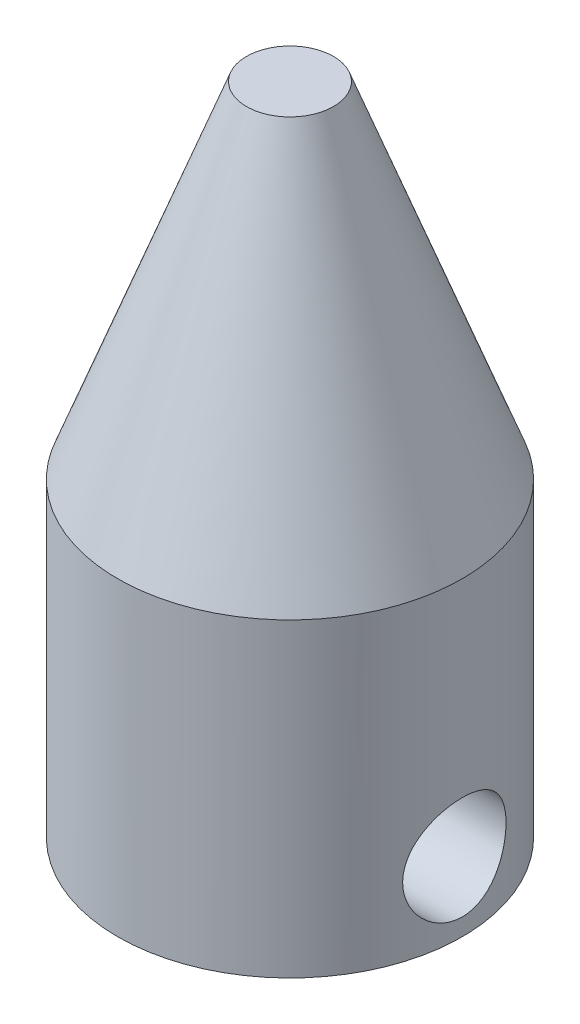
ISO-10303-21;
HEADER;
FILE_DESCRIPTION(('STEP AP214'),'2;1');
FILE_NAME('part.step','',(''),(''),'','','');
FILE_SCHEMA(('AUTOMOTIVE_DESIGN { 1 0 10303 214 1 1 1 1 }'));
ENDSEC;
DATA;
#1=APPLICATION_CONTEXT('core data for automotive mechanical design processes');
#2=APPLICATION_PROTOCOL_DEFINITION('international standard','automotive_design',2000,#1);
#3=PRODUCT_CONTEXT('',#1,'mechanical');
#4=PRODUCT('Part','Part','',(#3));
#5=PRODUCT_RELATED_PRODUCT_CATEGORY('part','',(#4));
#6=PRODUCT_DEFINITION_FORMATION('','',#4);
#7=PRODUCT_DEFINITION_CONTEXT('part definition',#1,'design');
#8=PRODUCT_DEFINITION('design','',#6,#7);
#9=PRODUCT_DEFINITION_SHAPE('','',#8);
#10=(LENGTH_UNIT() NAMED_UNIT(*) SI_UNIT(.MILLI.,.METRE.));
#11=(NAMED_UNIT(*) PLANE_ANGLE_UNIT() SI_UNIT($,.RADIAN.));
#12=(NAMED_UNIT(*) SI_UNIT($,.STERADIAN.) SOLID_ANGLE_UNIT());
#13=UNCERTAINTY_MEASURE_WITH_UNIT(LENGTH_MEASURE(1.E-05),#10,'distance_accuracy_value','');
#14=(GEOMETRIC_REPRESENTATION_CONTEXT(3) GLOBAL_UNCERTAINTY_ASSIGNED_CONTEXT((#13)) GLOBAL_UNIT_ASSIGNED_CONTEXT((#10,
#11,#12)) REPRESENTATION_CONTEXT('',''));
#15=CARTESIAN_POINT('',(0.,0.,0.));
#16=DIRECTION('',(0.,0.,1.));
#17=DIRECTION('',(1.,0.,0.));
#18=AXIS2_PLACEMENT_3D('',#15,#16,#17);
#19=CARTESIAN_POINT('',(0.,9.,0.));
#20=DIRECTION('',(0.,-1.,0.));
#21=DIRECTION('',(0.,0.,-1.));
#22=AXIS2_PLACEMENT_3D('',#19,#20,#21);
#23=CYLINDRICAL_SURFACE('',#22,5.);
#24=CARTESIAN_POINT('',(-5.,0.5,0.));
#25=CARTESIAN_POINT('',(-4.9999992925055,0.500000997484886,-0.0822886127533));
#26=CARTESIAN_POINT('',(-4.99794915693954,0.506793863623966,-0.164587318351529));
#27=CARTESIAN_POINT('',(-4.98997105593691,0.533721354222101,-0.326788125304881));
#28=CARTESIAN_POINT('',(-4.98404193389692,0.553859958023342,-0.40668950441142));
#29=CARTESIAN_POINT('',(-4.96895552501836,0.606746016910264,-0.561732707754527));
#30=CARTESIAN_POINT('',(-4.95980300250425,0.639474869618937,-0.636881364395373));
#31=CARTESIAN_POINT('',(-4.93922109237645,0.716536093055836,-0.780624181053131));
#32=CARTESIAN_POINT('',(-4.92779140192067,0.760870007395417,-0.84921746746967));
#33=CARTESIAN_POINT('',(-4.90350737192774,0.861224007472669,-0.979871797183745));
#34=CARTESIAN_POINT('',(-4.89062383657036,0.917516625885914,-1.04171807124434));
#35=CARTESIAN_POINT('',(-4.86505834210442,1.03960922991018,-1.15524920923324));
#36=CARTESIAN_POINT('',(-4.85237641724501,1.10541081212496,-1.20693236327441));
#37=CARTESIAN_POINT('',(-4.82834113993772,1.24647075303761,-1.29980037723708));
#38=CARTESIAN_POINT('',(-4.81702406663875,1.32190846099074,-1.34072309022213));
#39=CARTESIAN_POINT('',(-4.79743620394031,1.47898925423029,-1.4092139477476));
#40=CARTESIAN_POINT('',(-4.78916468313311,1.56063084392798,-1.43678529919973));
#41=CARTESIAN_POINT('',(-4.77690870838434,1.72539026613046,-1.47701633682652));
#42=CARTESIAN_POINT('',(-4.77281069324533,1.80840274386394,-1.49007196234677));
#43=CARTESIAN_POINT('',(-4.76902789749767,1.97553315621677,-1.50213730614672));
#44=CARTESIAN_POINT('',(-4.76934204760571,2.05965081805909,-1.50115042761078));
#45=CARTESIAN_POINT('',(-4.77424744067778,2.22338390860848,-1.48546977199812));
#46=CARTESIAN_POINT('',(-4.7786838859914,2.30305225036224,-1.47127205262685));
#47=CARTESIAN_POINT('',(-4.79108356228624,2.45881978627346,-1.43037420427056));
#48=CARTESIAN_POINT('',(-4.79904714132351,2.53491862737433,-1.40367284141641));
#49=CARTESIAN_POINT('',(-4.81772733074973,2.68260034966074,-1.33816026653682));
#50=CARTESIAN_POINT('',(-4.82848016115952,2.75410708395526,-1.29918816934642));
#51=CARTESIAN_POINT('',(-4.85150987000065,2.88973202201019,-1.21035222588683));
#52=CARTESIAN_POINT('',(-4.86378711746991,2.95384842941378,-1.16048574002588));
#53=CARTESIAN_POINT('',(-4.88911011297937,3.07568619076202,-1.04881290765546));
#54=CARTESIAN_POINT('',(-4.90216654310498,3.13302866402967,-0.986594907466972));
#55=CARTESIAN_POINT('',(-4.92712244063259,3.23655398406425,-0.853263259313967));
#56=CARTESIAN_POINT('',(-4.9390218351841,3.28273612841443,-0.782149051860888));
#57=CARTESIAN_POINT('',(-4.9604316006947,3.36285992246473,-0.632355038342803));
#58=CARTESIAN_POINT('',(-4.96992543668314,3.39671751624986,-0.55362774974795));
#59=CARTESIAN_POINT('',(-4.98533521832222,3.45059959009963,-0.39124541560352));
#60=CARTESIAN_POINT('',(-4.99125216186999,3.47062792853249,-0.307591751589582));
#61=CARTESIAN_POINT('',(-4.99868364643538,3.49565217789939,-0.140952242668332));
#62=CARTESIAN_POINT('',(-5.0003485041779,3.50116158580161,-0.0580500976011871));
#63=CARTESIAN_POINT('',(-4.9995292324176,3.49843084428792,0.107499605823383));
#64=CARTESIAN_POINT('',(-4.99704565677756,3.49019253034856,0.19014719669078));
#65=CARTESIAN_POINT('',(-4.98830696987163,3.4606153888885,0.350903605309697));
#66=CARTESIAN_POINT('',(-4.98213829799417,3.43957661241913,0.429072772614169));
#67=CARTESIAN_POINT('',(-4.96674347841533,3.3853567672218,0.580754638954522));
#68=CARTESIAN_POINT('',(-4.95751696321085,3.35217423896214,0.654266777025583));
#69=CARTESIAN_POINT('',(-4.93669654351325,3.27374683451887,0.796437189461052));
#70=CARTESIAN_POINT('',(-4.92505280829675,3.22824065905203,0.864943826199669));
#71=CARTESIAN_POINT('',(-4.90073468764318,3.12677524594719,0.993523307980147));
#72=CARTESIAN_POINT('',(-4.8880600443108,3.07081338811233,1.05359403235593));
#73=CARTESIAN_POINT('',(-4.86253171869138,2.94761269163066,1.16585744551027));
#74=CARTESIAN_POINT('',(-4.84968825033268,2.88003812422826,1.21768481231503));
#75=CARTESIAN_POINT('',(-4.82576515238464,2.73687206098647,1.30928995072154));
#76=CARTESIAN_POINT('',(-4.81468547654651,2.66128077544179,1.34906803829472));
#77=CARTESIAN_POINT('',(-4.79567189615055,2.50446750874531,1.41517347127168));
#78=CARTESIAN_POINT('',(-4.78772337843827,2.42327381346341,1.4415634693705));
#79=CARTESIAN_POINT('',(-4.77591594362794,2.25731203106852,1.48021730815114));
#80=CARTESIAN_POINT('',(-4.772055625083,2.17254517921233,1.49248598978779));
#81=CARTESIAN_POINT('',(-4.76899972496087,2.00563848162377,1.50221984485059));
#82=CARTESIAN_POINT('',(-4.76961647442754,1.92353634898242,1.5002805530849));
#83=CARTESIAN_POINT('',(-4.77499401288294,1.7608858966272,1.48307505444813));
#84=CARTESIAN_POINT('',(-4.77975463592551,1.68033751482365,1.46780938124716));
#85=CARTESIAN_POINT('',(-4.79275763670385,1.52405460085715,1.42476888804136));
#86=CARTESIAN_POINT('',(-4.80095604545965,1.44827271263831,1.39715175507068));
#87=CARTESIAN_POINT('',(-4.81990278909136,1.30235756118228,1.33031507121129));
#88=CARTESIAN_POINT('',(-4.83065161194312,1.23222538235924,1.29109329962876));
#89=CARTESIAN_POINT('',(-4.85397676425833,1.09683688347289,1.20048763805072));
#90=CARTESIAN_POINT('',(-4.86660540163798,1.03185123873959,1.14871276092994));
#91=CARTESIAN_POINT('',(-4.89201320450026,0.911297501692137,1.03517434629782));
#92=CARTESIAN_POINT('',(-4.90479240823905,0.855731860532243,0.973408217134502));
#93=CARTESIAN_POINT('',(-4.92950936570649,0.75397658770497,0.839465762183249));
#94=CARTESIAN_POINT('',(-4.94141159765674,0.708108553144511,0.767037885790608));
#95=CARTESIAN_POINT('',(-4.96260680455813,0.629264830095975,0.615141373983529));
#96=CARTESIAN_POINT('',(-4.97190099931067,0.596283111725492,0.535676052998955));
#97=CARTESIAN_POINT('',(-4.98602174969301,0.547104724347251,0.380757712655282));
#98=CARTESIAN_POINT('',(-4.99122027381068,0.529488327116752,0.305786961954234));
#99=CARTESIAN_POINT('',(-4.99820944494492,0.505936474758423,0.15388019523078));
#100=CARTESIAN_POINT('',(-5.0000006615474,0.499999067295181,0.0769445098581397));
#101=CARTESIAN_POINT('',(-5.,0.5,0.));
#102=B_SPLINE_CURVE_WITH_KNOTS('',3,(#24,#25,#26,#27,#28,#29,#30,#31,#32,#33,#34,#35,#36,#37,
#38,#39,#40,#41,#42,#43,#44,#45,#46,#47,#48,#49,#50,#51,#52,#53,#54,#55,#56,#57,#58,#59,#60,#61,
#62,#63,#64,#65,#66,#67,#68,#69,#70,#71,#72,#73,#74,#75,#76,#77,#78,#79,#80,#81,#82,#83,#84,#85,
#86,#87,#88,#89,#90,#91,#92,#93,#94,#95,#96,#97,#98,#99,#100,#101),.UNSPECIFIED.,.T.,.F.,(4,2,2,
2,2,2,2,2,2,2,2,2,2,2,2,2,2,2,2,2,2,2,2,2,2,2,2,2,2,2,2,2,2,2,2,2,2,2,4),(0.,0.246583203612611,
0.493239964846,0.739533676300874,0.985860164412702,1.23855602948191,1.49129437288633,
1.74971481004109,2.00807314543224,2.25919689356599,2.51025978319089,2.75226016697676,
2.99428443658001,3.23962426447119,3.48502360158555,3.74067104048166,3.99633456531071,
4.25371046881688,4.51101453528808,4.75908809438545,5.00712853550327,5.24956746682327,
5.49203554593728,5.74011305702908,5.98825282000191,6.24540400322818,6.5025484425268,
6.75847814951252,7.01432009460283,7.25950155466943,7.504673196616,7.74680040402721,
7.98897397553107,8.23996925679931,8.49102974897502,8.74942996156671,9.00770911595235,
9.23831691930459,9.46888616948874),.UNSPECIFIED.);
#103=CARTESIAN_POINT('',(-5.,0.5,0.));
#104=VERTEX_POINT('',#103);
#105=EDGE_CURVE('E11',#104,#104,#102,.T.);
#106=ORIENTED_EDGE('',*,*,#105,.T.);
#107=EDGE_LOOP('',(#106));
#108=FACE_BOUND('',#107,.T.);
#109=CARTESIAN_POINT('',(4.76969600708473,2.,-1.5));
#110=CARTESIAN_POINT('',(4.7696968572698,1.9178054520576,-1.49999897633764));
#111=CARTESIAN_POINT('',(4.77184390209069,1.83560077585598,-1.49322108167142));
#112=CARTESIAN_POINT('',(4.780165783029,1.67359475040806,-1.46635844446749));
#113=CARTESIAN_POINT('',(4.78634196493468,1.59379421349853,-1.44626925573578));
#114=CARTESIAN_POINT('',(4.80196102485632,1.43896527172827,-1.39352753269955));
#115=CARTESIAN_POINT('',(4.81139846703232,1.36392917036691,-1.36089589394243));
#116=CARTESIAN_POINT('',(4.83246932547567,1.2203780660047,-1.28406421917929));
#117=CARTESIAN_POINT('',(4.84410307041019,1.15186404131556,-1.23986245137053));
#118=CARTESIAN_POINT('',(4.86866862185765,1.02113360942262,-1.13964754141627));
#119=CARTESIAN_POINT('',(4.88162808311636,0.959154102053713,-1.08333207175807));
#120=CARTESIAN_POINT('',(4.90714861936757,0.845362048677491,-0.961136237579599));
#121=CARTESIAN_POINT('',(4.91970964297705,0.793550809550121,-0.895254645461111));
#122=CARTESIAN_POINT('',(4.94333214579389,0.700537300166693,-0.75411143779369));
#123=CARTESIAN_POINT('',(4.95435724342404,0.659576575557191,-0.678684021335815));
#124=CARTESIAN_POINT('',(4.97334435920684,0.591012740957243,-0.521624645369354));
#125=CARTESIAN_POINT('',(4.98130703789495,0.563406750142551,-0.439994028387912));
#126=CARTESIAN_POINT('',(4.99307646003589,0.523119998909491,-0.27532385263083));
#127=CARTESIAN_POINT('',(4.99699557369338,0.510034872347297,-0.192391398953801));
#128=CARTESIAN_POINT('',(5.00063201501348,0.497882675353559,-0.025421823749315));
#129=CARTESIAN_POINT('',(5.00035022521079,0.498812660598037,0.0586150620503682));
#130=CARTESIAN_POINT('',(4.99569603817659,0.514392868543023,0.22257115660016));
#131=CARTESIAN_POINT('',(4.9914542020526,0.528605193809869,0.302536267641341));
#132=CARTESIAN_POINT('',(4.97951522112593,0.56963133599429,0.458889213442527));
#133=CARTESIAN_POINT('',(4.97181785750586,0.596445950942671,0.535276821322846));
#134=CARTESIAN_POINT('',(4.95365220986963,0.662212023418558,0.683347326351281));
#135=CARTESIAN_POINT('',(4.94315269676706,0.701301202807267,0.754965064694478));
#136=CARTESIAN_POINT('',(4.92049640648069,0.790397852428228,0.890764673783156));
#137=CARTESIAN_POINT('',(4.90833923637778,0.840407912963484,0.954944774872131));
#138=CARTESIAN_POINT('',(4.88311550488165,0.952197750751597,1.0766604815298));
#139=CARTESIAN_POINT('',(4.87003195321461,1.01435691902974,1.13384458040111));
#140=CARTESIAN_POINT('',(4.84483979887497,1.14751001789005,1.23707651539824));
#141=CARTESIAN_POINT('',(4.8327312931702,1.21850482538923,1.28312324482853));
#142=CARTESIAN_POINT('',(4.81077903197678,1.36823946924899,1.3631399533545));
#143=CARTESIAN_POINT('',(4.80095810695957,1.44704704586292,1.39698989237679));
#144=CARTESIAN_POINT('',(4.78496392548436,1.60960720844554,1.45083362878413));
#145=CARTESIAN_POINT('',(4.7787894791583,1.69335817153456,1.4708319464056));
#146=CARTESIAN_POINT('',(4.77104849541241,1.86008236073928,1.49574770282165));
#147=CARTESIAN_POINT('',(4.7693187867044,1.94296822389398,1.50119946380212));
#148=CARTESIAN_POINT('',(4.77021192441924,2.10847290000987,1.49835947233062));
#149=CARTESIAN_POINT('',(4.77283416156589,2.19109174873085,1.4900696437133));
#150=CARTESIAN_POINT('',(4.78197558554912,2.35148837797087,1.4604576357419));
#151=CARTESIAN_POINT('',(4.78839176507489,2.42933616426352,1.4394796143128));
#152=CARTESIAN_POINT('',(4.80429141231227,2.58040169081492,1.3854857774794));
#153=CARTESIAN_POINT('',(4.81377535359073,2.65361871414057,1.3524681034276));
#154=CARTESIAN_POINT('',(4.83505835023047,2.79551746407213,1.274318711965));
#155=CARTESIAN_POINT('',(4.84691271069799,2.86402472098579,1.22888564172729));
#156=CARTESIAN_POINT('',(4.87148205646987,2.9926381061808,1.12755301600385));
#157=CARTESIAN_POINT('',(4.88419724730003,3.05274221761279,1.07165095534897));
#158=CARTESIAN_POINT('',(4.90963633548158,3.16518040581474,0.948455132493599));
#159=CARTESIAN_POINT('',(4.92234245063004,3.21713562898698,0.880811065857434));
#160=CARTESIAN_POINT('',(4.94584851748651,3.30896670102775,0.737461784590249));
#161=CARTESIAN_POINT('',(4.95664856384717,3.34884314978146,0.661756970543944));
#162=CARTESIAN_POINT('',(4.97505970474957,3.4150000305683,0.504935504705222));
#163=CARTESIAN_POINT('',(4.98269453424966,3.44138201615898,0.423864622037839));
#164=CARTESIAN_POINT('',(4.99401979596827,3.48006091889042,0.258169966504588));
#165=CARTESIAN_POINT('',(4.9977113567088,3.49236186594842,0.173547217354763));
#166=CARTESIAN_POINT('',(5.00066544081399,3.5022230440545,0.00665215388274265));
#167=CARTESIAN_POINT('',(5.00009305111322,3.50033269540783,-0.0755851790862068));
#168=CARTESIAN_POINT('',(4.99497264465037,3.48317836750088,-0.238519481164404));
#169=CARTESIAN_POINT('',(4.99042485330462,3.46791514651956,-0.319216537346529));
#170=CARTESIAN_POINT('',(4.97791168358327,3.42478833860038,-0.475935813041358));
#171=CARTESIAN_POINT('',(4.96998352900866,3.39706181935099,-0.551998927351392));
#172=CARTESIAN_POINT('',(4.9515294303945,3.32991808549281,-0.698433237752053));
#173=CARTESIAN_POINT('',(4.94100305949946,3.29049894971381,-0.76880349605058));
#174=CARTESIAN_POINT('',(4.91803965828228,3.19962654256996,-0.904301892420563));
#175=CARTESIAN_POINT('',(4.90555226923559,3.14782856999923,-0.969190250076767));
#176=CARTESIAN_POINT('',(4.88023537212334,3.0342896116672,-1.08953757134594));
#177=CARTESIAN_POINT('',(4.86740576641079,2.97254576210185,-1.14499380960194));
#178=CARTESIAN_POINT('',(4.84240680631319,2.83865922168949,-1.24656269394549));
#179=CARTESIAN_POINT('',(4.83026852693485,2.76626144660956,-1.29234759757956));
#180=CARTESIAN_POINT('',(4.80852547508793,2.61444482583898,-1.37104313528776));
#181=CARTESIAN_POINT('',(4.79891948596956,2.53502937639881,-1.40395995557289));
#182=CARTESIAN_POINT('',(4.78427816717594,2.38025956839373,-1.4530194253295));
#183=CARTESIAN_POINT('',(4.7788615484052,2.30539135306901,-1.47058859011232));
#184=CARTESIAN_POINT('',(4.77157042597167,2.15368477750423,-1.49407818835144));
#185=CARTESIAN_POINT('',(4.7696952122143,2.07684681535475,-1.50000095706095));
#186=CARTESIAN_POINT('',(4.76969600708473,2.,-1.5));
#187=B_SPLINE_CURVE_WITH_KNOTS('',3,(#109,#110,#111,#112,#113,#114,#115,#116,#117,#118,#119,
#120,#121,#122,#123,#124,#125,#126,#127,#128,#129,#130,#131,#132,#133,#134,#135,#136,#137,#138,
#139,#140,#141,#142,#143,#144,#145,#146,#147,#148,#149,#150,#151,#152,#153,#154,#155,#156,#157,
#158,#159,#160,#161,#162,#163,#164,#165,#166,#167,#168,#169,#170,#171,#172,#173,#174,#175,#176,
#177,#178,#179,#180,#181,#182,#183,#184,#185,#186),.UNSPECIFIED.,.T.,.F.,(4,2,2,2,2,2,2,2,2,2,2,
2,2,2,2,2,2,2,2,2,2,2,2,2,2,2,2,2,2,2,2,2,2,2,2,2,2,2,4),(0.,0.246300165915542,0.492682641689,
0.738656414466193,0.984667025370101,1.23773150007984,1.49082847871273,1.74915939273645,
2.00743455587877,2.25832140149558,2.5091555410144,2.7520012599088,2.99486235890376,
3.24055209335676,3.4863001659083,3.74152147023278,3.99676812491863,4.25446238246266,
4.51207250628411,4.76008080790309,5.00805439107388,5.24958594938817,5.49115481045787,
5.73920731809388,5.98731925928923,6.24479506100602,6.50225807324202,6.75775391814325,
7.01317662321682,7.2587630391122,7.50433553047755,7.74727096872219,7.99024634491378,
8.24099627054488,8.4918185262989,8.75011639669147,9.00828993963944,9.23861153857447,
9.4688869503356),.UNSPECIFIED.);
#188=CARTESIAN_POINT('',(4.76969600708473,2.,-1.5));
#189=VERTEX_POINT('',#188);
#190=EDGE_CURVE('E41',#189,#189,#187,.T.);
#191=ORIENTED_EDGE('',*,*,#190,.T.);
#192=EDGE_LOOP('',(#191));
#193=FACE_BOUND('',#192,.T.);
#194=CARTESIAN_POINT('',(0.,9.,0.));
#195=DIRECTION('',(0.,-1.,0.));
#196=DIRECTION('',(0.,0.,-1.));
#197=AXIS2_PLACEMENT_3D('',#194,#195,#196);
#198=CIRCLE('',#197,5.);
#199=CARTESIAN_POINT('',(0.,9.,-5.));
#200=VERTEX_POINT('',#199);
#201=EDGE_CURVE('E46',#200,#200,#198,.F.);
#202=ORIENTED_EDGE('',*,*,#201,.F.);
#203=EDGE_LOOP('',(#202));
#204=FACE_BOUND('',#203,.T.);
#205=CARTESIAN_POINT('',(0.,0.,0.));
#206=DIRECTION('',(0.,1.,0.));
#207=DIRECTION('',(0.,0.,1.));
#208=AXIS2_PLACEMENT_3D('',#205,#206,#207);
#209=CIRCLE('',#208,5.);
#210=CARTESIAN_POINT('',(0.,0.,5.));
#211=VERTEX_POINT('',#210);
#212=EDGE_CURVE('E72',#211,#211,#209,.T.);
#213=ORIENTED_EDGE('',*,*,#212,.T.);
#214=EDGE_LOOP('',(#213));
#215=FACE_BOUND('',#214,.T.);
#216=ADVANCED_FACE('F33',(#108,#193,#204,#215),#23,.T.);
#217=CARTESIAN_POINT('',(0.,0.,0.));
#218=DIRECTION('',(0.,1.,0.));
#219=DIRECTION('',(0.,0.,1.));
#220=AXIS2_PLACEMENT_3D('',#217,#218,#219);
#221=PLANE('',#220);
#222=ORIENTED_EDGE('',*,*,#212,.F.);
#223=EDGE_LOOP('',(#222));
#224=FACE_BOUND('',#223,.T.);
#225=ADVANCED_FACE('F59',(#224),#221,.F.);
#226=CARTESIAN_POINT('',(-5.,2.,0.));
#227=DIRECTION('',(1.,0.,0.));
#228=DIRECTION('',(0.,0.,-1.));
#229=AXIS2_PLACEMENT_3D('',#226,#227,#228);
#230=CYLINDRICAL_SURFACE('',#229,1.5);
#231=ORIENTED_EDGE('',*,*,#190,.F.);
#232=EDGE_LOOP('',(#231));
#233=FACE_BOUND('',#232,.T.);
#234=ORIENTED_EDGE('',*,*,#105,.F.);
#235=EDGE_LOOP('',(#234));
#236=FACE_BOUND('',#235,.T.);
#237=ADVANCED_FACE('F54',(#233,#236),#230,.F.);
#238=CARTESIAN_POINT('',(0.,19.,0.));
#239=DIRECTION('',(0.,1.,0.));
#240=DIRECTION('',(0.,0.,1.));
#241=AXIS2_PLACEMENT_3D('',#238,#239,#240);
#242=PLANE('',#241);
#243=CARTESIAN_POINT('',(0.,19.,0.));
#244=DIRECTION('',(0.,1.,0.));
#245=DIRECTION('',(0.,0.,1.));
#246=AXIS2_PLACEMENT_3D('',#243,#244,#245);
#247=CIRCLE('',#246,1.262);
#248=CARTESIAN_POINT('',(0.,19.,-1.262));
#249=VERTEX_POINT('',#248);
#250=EDGE_CURVE('E74',#249,#249,#247,.T.);
#251=ORIENTED_EDGE('',*,*,#250,.T.);
#252=EDGE_LOOP('',(#251));
#253=FACE_BOUND('',#252,.T.);
#254=ADVANCED_FACE('F58',(#253),#242,.T.);
#255=CARTESIAN_POINT('',(0.,19.,0.));
#256=DIRECTION('',(0.,-1.,0.));
#257=DIRECTION('',(0.,0.,-1.));
#258=AXIS2_PLACEMENT_3D('',#255,#256,#257);
#259=CONICAL_SURFACE('',#258,1.262,0.357718200643609);
#260=CARTESIAN_POINT('',(0.,19.,-1.262));
#261=CARTESIAN_POINT('',(0.,18.8958333333333,-1.3009375));
#262=CARTESIAN_POINT('',(0.,18.7916666666667,-1.339875));
#263=CARTESIAN_POINT('',(0.,18.5833333333333,-1.41775));
#264=CARTESIAN_POINT('',(0.,18.4791666666667,-1.4566875));
#265=CARTESIAN_POINT('',(0.,18.2708333333333,-1.5345625));
#266=CARTESIAN_POINT('',(0.,18.1666666666667,-1.5735));
#267=CARTESIAN_POINT('',(0.,17.9583333333333,-1.651375));
#268=CARTESIAN_POINT('',(0.,17.8541666666667,-1.6903125));
#269=CARTESIAN_POINT('',(0.,17.6458333333333,-1.7681875));
#270=CARTESIAN_POINT('',(0.,17.5416666666667,-1.807125));
#271=CARTESIAN_POINT('',(0.,17.3333333333333,-1.885));
#272=CARTESIAN_POINT('',(0.,17.2291666666667,-1.9239375));
#273=CARTESIAN_POINT('',(0.,17.0208333333333,-2.0018125));
#274=CARTESIAN_POINT('',(0.,16.9166666666667,-2.04075));
#275=CARTESIAN_POINT('',(0.,16.7083333333333,-2.118625));
#276=CARTESIAN_POINT('',(0.,16.6041666666667,-2.1575625));
#277=CARTESIAN_POINT('',(0.,16.3958333333333,-2.2354375));
#278=CARTESIAN_POINT('',(0.,16.2916666666667,-2.274375));
#279=CARTESIAN_POINT('',(0.,16.0833333333333,-2.35225));
#280=CARTESIAN_POINT('',(0.,15.9791666666667,-2.3911875));
#281=CARTESIAN_POINT('',(0.,15.7708333333333,-2.4690625));
#282=CARTESIAN_POINT('',(0.,15.6666666666667,-2.508));
#283=CARTESIAN_POINT('',(0.,15.4583333333333,-2.585875));
#284=CARTESIAN_POINT('',(0.,15.3541666666667,-2.6248125));
#285=CARTESIAN_POINT('',(0.,15.1458333333333,-2.7026875));
#286=CARTESIAN_POINT('',(0.,15.0416666666667,-2.741625));
#287=CARTESIAN_POINT('',(0.,14.8333333333333,-2.8195));
#288=CARTESIAN_POINT('',(0.,14.7291666666667,-2.8584375));
#289=CARTESIAN_POINT('',(0.,14.5208333333333,-2.9363125));
#290=CARTESIAN_POINT('',(0.,14.4166666666667,-2.97525));
#291=CARTESIAN_POINT('',(0.,14.2083333333333,-3.053125));
#292=CARTESIAN_POINT('',(0.,14.1041666666667,-3.0920625));
#293=CARTESIAN_POINT('',(0.,13.8958333333333,-3.1699375));
#294=CARTESIAN_POINT('',(0.,13.7916666666667,-3.208875));
#295=CARTESIAN_POINT('',(0.,13.5833333333333,-3.28675));
#296=CARTESIAN_POINT('',(0.,13.4791666666667,-3.3256875));
#297=CARTESIAN_POINT('',(0.,13.2708333333333,-3.4035625));
#298=CARTESIAN_POINT('',(0.,13.1666666666667,-3.4425));
#299=CARTESIAN_POINT('',(0.,12.9583333333333,-3.520375));
#300=CARTESIAN_POINT('',(0.,12.8541666666667,-3.5593125));
#301=CARTESIAN_POINT('',(0.,12.6458333333333,-3.6371875));
#302=CARTESIAN_POINT('',(0.,12.5416666666667,-3.676125));
#303=CARTESIAN_POINT('',(0.,12.3333333333333,-3.754));
#304=CARTESIAN_POINT('',(0.,12.2291666666667,-3.7929375));
#305=CARTESIAN_POINT('',(0.,12.0208333333333,-3.8708125));
#306=CARTESIAN_POINT('',(0.,11.9166666666667,-3.90975));
#307=CARTESIAN_POINT('',(0.,11.7083333333333,-3.987625));
#308=CARTESIAN_POINT('',(0.,11.6041666666667,-4.0265625));
#309=CARTESIAN_POINT('',(0.,11.3958333333333,-4.1044375));
#310=CARTESIAN_POINT('',(0.,11.2916666666667,-4.143375));
#311=CARTESIAN_POINT('',(0.,11.0833333333333,-4.22125));
#312=CARTESIAN_POINT('',(0.,10.9791666666667,-4.2601875));
#313=CARTESIAN_POINT('',(0.,10.7708333333333,-4.3380625));
#314=CARTESIAN_POINT('',(0.,10.6666666666667,-4.377));
#315=CARTESIAN_POINT('',(0.,10.4583333333333,-4.454875));
#316=CARTESIAN_POINT('',(0.,10.3541666666667,-4.4938125));
#317=CARTESIAN_POINT('',(0.,10.1458333333333,-4.5716875));
#318=CARTESIAN_POINT('',(0.,10.0416666666667,-4.610625));
#319=CARTESIAN_POINT('',(0.,9.83333333333333,-4.6885));
#320=CARTESIAN_POINT('',(0.,9.72916666666667,-4.7274375));
#321=CARTESIAN_POINT('',(0.,9.52083333333333,-4.8053125));
#322=CARTESIAN_POINT('',(0.,9.41666666666667,-4.84425));
#323=CARTESIAN_POINT('',(0.,9.20833333333333,-4.922125));
#324=CARTESIAN_POINT('',(0.,9.10416666666667,-4.9610625));
#325=CARTESIAN_POINT('',(0.,9.,-5.));
#326=B_SPLINE_CURVE_WITH_KNOTS('',3,(#260,#261,#262,#263,#264,#265,#266,#267,#268,#269,#270,
#271,#272,#273,#274,#275,#276,#277,#278,#279,#280,#281,#282,#283,#284,#285,#286,#287,#288,#289,
#290,#291,#292,#293,#294,#295,#296,#297,#298,#299,#300,#301,#302,#303,#304,#305,#306,#307,#308,
#309,#310,#311,#312,#313,#314,#315,#316,#317,#318,#319,#320,#321,#322,#323,#324,#325),
.UNSPECIFIED.,.F.,.F.,(4,2,2,2,2,2,2,2,2,2,2,2,2,2,2,2,2,2,2,2,2,2,2,2,2,2,2,2,2,2,2,2,4),(0.,
0.333618659784266,0.667237319568533,1.0008559793528,1.33447463913707,1.66809329892133,
2.0017119587056,2.33533061848987,2.66894927827413,3.0025679380584,3.33618659784266,
3.66980525762693,4.0034239174112,4.33704257719546,4.67066123697973,5.00427989676399,
5.33789855654826,5.67151721633253,6.00513587611679,6.33875453590106,6.67237319568532,
7.00599185546959,7.33961051525386,7.67322917503812,8.00684783482239,8.34046649460665,
8.67408515439092,9.00770381417519,9.34132247395945,9.67494113374372,10.008559793528,
10.3421784533122,10.6757971130965),.UNSPECIFIED.);
#327=EDGE_CURVE('BSEAM61',#249,#200,#326,.T.);
#328=ORIENTED_EDGE('',*,*,#250,.F.);
#329=ORIENTED_EDGE('',*,*,#201,.T.);
#330=ORIENTED_EDGE('',*,*,#327,.T.);
#331=ORIENTED_EDGE('',*,*,#327,.F.);
#332=EDGE_LOOP('',(#328,#330,#329,#331));
#333=FACE_BOUND('',#332,.T.);
#334=ADVANCED_FACE('F61',(#333),#259,.T.);
#335=CLOSED_SHELL('',(#216,#225,#237,#254,#334));
#336=MANIFOLD_SOLID_BREP('B2',#335);
#337=ADVANCED_BREP_SHAPE_REPRESENTATION('',(#18,#336),#14);
#338=SHAPE_DEFINITION_REPRESENTATION(#9,#337);
ENDSEC;
END-ISO-10303-21;
